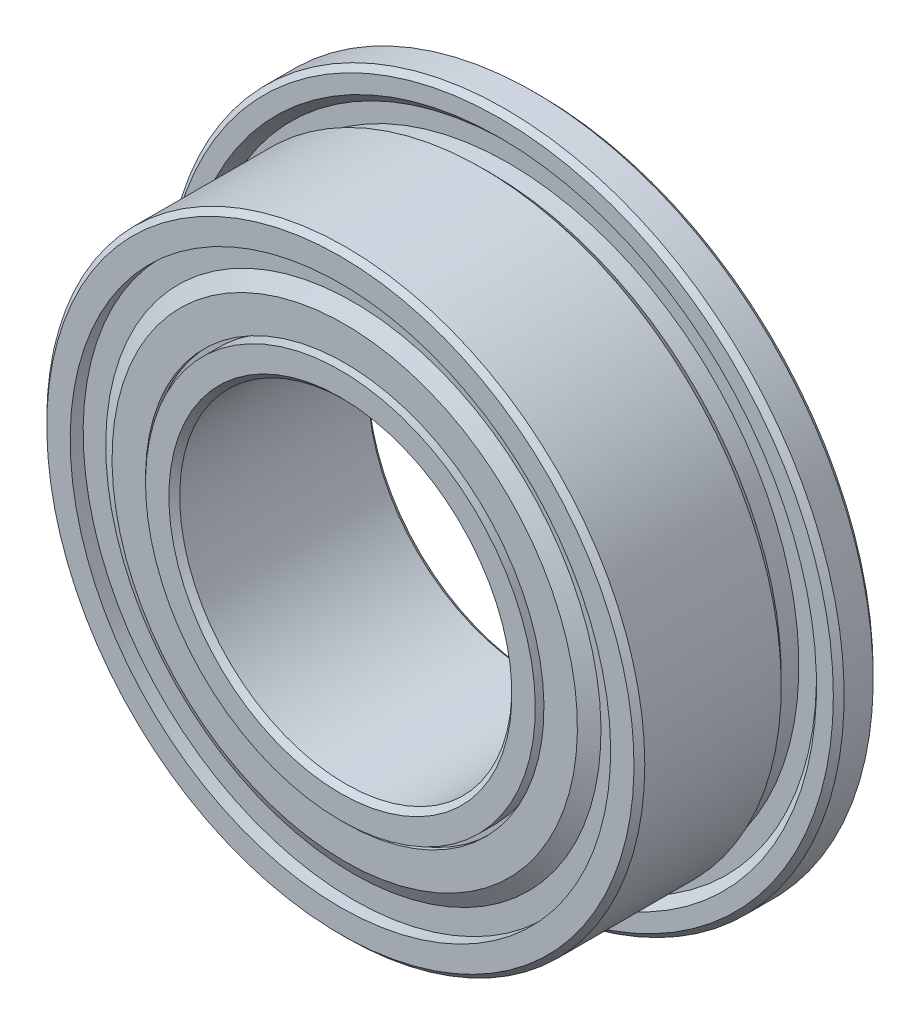
ISO-10303-21;
HEADER;
FILE_DESCRIPTION(('STEP AP214'),'2;1');
FILE_NAME('part.step','',(''),(''),'','','');
FILE_SCHEMA(('AUTOMOTIVE_DESIGN { 1 0 10303 214 1 1 1 1 }'));
ENDSEC;
DATA;
#1=APPLICATION_CONTEXT('core data for automotive mechanical design processes');
#2=APPLICATION_PROTOCOL_DEFINITION('international standard','automotive_design',2000,#1);
#3=PRODUCT_CONTEXT('',#1,'mechanical');
#4=PRODUCT('Part','Part','',(#3));
#5=PRODUCT_RELATED_PRODUCT_CATEGORY('part','',(#4));
#6=PRODUCT_DEFINITION_FORMATION('','',#4);
#7=PRODUCT_DEFINITION_CONTEXT('part definition',#1,'design');
#8=PRODUCT_DEFINITION('design','',#6,#7);
#9=PRODUCT_DEFINITION_SHAPE('','',#8);
#10=(LENGTH_UNIT() NAMED_UNIT(*) SI_UNIT(.MILLI.,.METRE.));
#11=(NAMED_UNIT(*) PLANE_ANGLE_UNIT() SI_UNIT($,.RADIAN.));
#12=(NAMED_UNIT(*) SI_UNIT($,.STERADIAN.) SOLID_ANGLE_UNIT());
#13=UNCERTAINTY_MEASURE_WITH_UNIT(LENGTH_MEASURE(1.E-05),#10,'distance_accuracy_value','');
#14=(GEOMETRIC_REPRESENTATION_CONTEXT(3) GLOBAL_UNCERTAINTY_ASSIGNED_CONTEXT((#13)) GLOBAL_UNIT_ASSIGNED_CONTEXT((#10,
#11,#12)) REPRESENTATION_CONTEXT('',''));
#15=CARTESIAN_POINT('',(0.,0.,0.));
#16=DIRECTION('',(0.,0.,1.));
#17=DIRECTION('',(1.,0.,0.));
#18=AXIS2_PLACEMENT_3D('',#15,#16,#17);
#19=CARTESIAN_POINT('',(0.,0.,0.));
#20=DIRECTION('',(0.,0.,1.));
#21=DIRECTION('',(0.,-1.,0.));
#22=AXIS2_PLACEMENT_3D('',#19,#20,#21);
#23=CYLINDRICAL_SURFACE('',#22,4.06666666666667);
#24=CARTESIAN_POINT('',(0.,0.,-1.24));
#25=DIRECTION('',(0.,0.,1.));
#26=DIRECTION('',(0.,-1.,0.));
#27=AXIS2_PLACEMENT_3D('',#24,#25,#26);
#28=CIRCLE('',#27,4.06666666666667);
#29=CARTESIAN_POINT('',(0.,-4.06666666666667,-1.24));
#30=VERTEX_POINT('',#29);
#31=EDGE_CURVE('E73',#30,#30,#28,.T.);
#32=ORIENTED_EDGE('',*,*,#31,.F.);
#33=EDGE_LOOP('',(#32));
#34=FACE_BOUND('',#33,.T.);
#35=CARTESIAN_POINT('',(0.,0.,-1.305));
#36=DIRECTION('',(0.,0.,1.));
#37=DIRECTION('',(0.,-1.,0.));
#38=AXIS2_PLACEMENT_3D('',#35,#36,#37);
#39=CIRCLE('',#38,4.06666666666667);
#40=CARTESIAN_POINT('',(0.,-4.06666666666667,-1.305));
#41=VERTEX_POINT('',#40);
#42=EDGE_CURVE('E12',#41,#41,#39,.T.);
#43=ORIENTED_EDGE('',*,*,#42,.T.);
#44=EDGE_LOOP('',(#43));
#45=FACE_BOUND('',#44,.T.);
#46=ADVANCED_FACE('F45',(#34,#45),#23,.T.);
#47=CARTESIAN_POINT('',(0.,4.06666666666667,-1.305));
#48=DIRECTION('',(0.,0.,1.));
#49=DIRECTION('',(0.,-1.,0.));
#50=AXIS2_PLACEMENT_3D('',#47,#48,#49);
#51=PLANE('',#50);
#52=ORIENTED_EDGE('',*,*,#42,.F.);
#53=EDGE_LOOP('',(#52));
#54=FACE_BOUND('',#53,.T.);
#55=CARTESIAN_POINT('',(0.,0.,-1.305));
#56=DIRECTION('',(0.,0.,1.));
#57=DIRECTION('',(0.,-1.,0.));
#58=AXIS2_PLACEMENT_3D('',#55,#56,#57);
#59=CIRCLE('',#58,3.72694050703183);
#60=CARTESIAN_POINT('',(0.,-3.72694050703183,-1.305));
#61=VERTEX_POINT('',#60);
#62=EDGE_CURVE('E51',#61,#61,#59,.T.);
#63=ORIENTED_EDGE('',*,*,#62,.T.);
#64=EDGE_LOOP('',(#63));
#65=FACE_BOUND('',#64,.T.);
#66=ADVANCED_FACE('F80',(#54,#65),#51,.F.);
#67=CARTESIAN_POINT('',(0.,0.,-1.435));
#68=DIRECTION('',(0.,0.,1.));
#69=DIRECTION('',(0.,-1.,0.));
#70=AXIS2_PLACEMENT_3D('',#67,#68,#69);
#71=CONICAL_SURFACE('',#70,3.50177390204788,1.0471975511966);
#72=ORIENTED_EDGE('',*,*,#62,.F.);
#73=EDGE_LOOP('',(#72));
#74=FACE_BOUND('',#73,.T.);
#75=CARTESIAN_POINT('',(0.,0.,-1.435));
#76=DIRECTION('',(0.,0.,1.));
#77=DIRECTION('',(0.,-1.,0.));
#78=AXIS2_PLACEMENT_3D('',#75,#76,#77);
#79=CIRCLE('',#78,3.50177390204788);
#80=CARTESIAN_POINT('',(0.,-3.50177390204788,-1.435));
#81=VERTEX_POINT('',#80);
#82=EDGE_CURVE('E55',#81,#81,#79,.T.);
#83=ORIENTED_EDGE('',*,*,#82,.T.);
#84=EDGE_LOOP('',(#83));
#85=FACE_BOUND('',#84,.T.);
#86=ADVANCED_FACE('F84',(#74,#85),#71,.T.);
#87=CARTESIAN_POINT('',(0.,3.50177390204788,-1.435));
#88=DIRECTION('',(0.,0.,1.));
#89=DIRECTION('',(0.,-1.,0.));
#90=AXIS2_PLACEMENT_3D('',#87,#88,#89);
#91=PLANE('',#90);
#92=ORIENTED_EDGE('',*,*,#82,.F.);
#93=EDGE_LOOP('',(#92));
#94=FACE_BOUND('',#93,.T.);
#95=CARTESIAN_POINT('',(0.,0.,-1.435));
#96=DIRECTION('',(0.,0.,1.));
#97=DIRECTION('',(0.,-1.,0.));
#98=AXIS2_PLACEMENT_3D('',#95,#96,#97);
#99=CIRCLE('',#98,2.99833333333333);
#100=CARTESIAN_POINT('',(0.,-2.99833333333333,-1.435));
#101=VERTEX_POINT('',#100);
#102=EDGE_CURVE('E59',#101,#101,#99,.T.);
#103=ORIENTED_EDGE('',*,*,#102,.T.);
#104=EDGE_LOOP('',(#103));
#105=FACE_BOUND('',#104,.T.);
#106=ADVANCED_FACE('F89',(#94,#105),#91,.F.);
#107=CARTESIAN_POINT('',(0.,0.,0.));
#108=DIRECTION('',(0.,0.,1.));
#109=DIRECTION('',(0.,-1.,0.));
#110=AXIS2_PLACEMENT_3D('',#107,#108,#109);
#111=CYLINDRICAL_SURFACE('',#110,2.99833333333333);
#112=ORIENTED_EDGE('',*,*,#102,.F.);
#113=EDGE_LOOP('',(#112));
#114=FACE_BOUND('',#113,.T.);
#115=CARTESIAN_POINT('',(0.,0.,-1.37));
#116=DIRECTION('',(0.,0.,1.));
#117=DIRECTION('',(0.,-1.,0.));
#118=AXIS2_PLACEMENT_3D('',#115,#116,#117);
#119=CIRCLE('',#118,2.99833333333333);
#120=CARTESIAN_POINT('',(0.,-2.99833333333333,-1.37));
#121=VERTEX_POINT('',#120);
#122=EDGE_CURVE('E64',#121,#121,#119,.T.);
#123=ORIENTED_EDGE('',*,*,#122,.T.);
#124=EDGE_LOOP('',(#123));
#125=FACE_BOUND('',#124,.T.);
#126=ADVANCED_FACE('F95',(#114,#125),#111,.F.);
#127=CARTESIAN_POINT('',(0.,3.48435720453986,-1.37));
#128=DIRECTION('',(0.,0.,-1.));
#129=DIRECTION('',(0.,1.,0.));
#130=AXIS2_PLACEMENT_3D('',#127,#128,#129);
#131=PLANE('',#130);
#132=ORIENTED_EDGE('',*,*,#122,.F.);
#133=EDGE_LOOP('',(#132));
#134=FACE_BOUND('',#133,.T.);
#135=CARTESIAN_POINT('',(0.,0.,-1.37));
#136=DIRECTION('',(0.,0.,1.));
#137=DIRECTION('',(0.,-1.,0.));
#138=AXIS2_PLACEMENT_3D('',#135,#136,#137);
#139=CIRCLE('',#138,3.48435720453986);
#140=CARTESIAN_POINT('',(0.,-3.48435720453986,-1.37));
#141=VERTEX_POINT('',#140);
#142=EDGE_CURVE('E67',#141,#141,#139,.T.);
#143=ORIENTED_EDGE('',*,*,#142,.T.);
#144=EDGE_LOOP('',(#143));
#145=FACE_BOUND('',#144,.T.);
#146=ADVANCED_FACE('F99',(#134,#145),#131,.F.);
#147=CARTESIAN_POINT('',(0.,0.,-1.24));
#148=DIRECTION('',(0.,0.,1.));
#149=DIRECTION('',(0.,-1.,0.));
#150=AXIS2_PLACEMENT_3D('',#147,#148,#149);
#151=CONICAL_SURFACE('',#150,3.70952380952381,1.0471975511966);
#152=ORIENTED_EDGE('',*,*,#142,.F.);
#153=EDGE_LOOP('',(#152));
#154=FACE_BOUND('',#153,.T.);
#155=CARTESIAN_POINT('',(0.,0.,-1.24));
#156=DIRECTION('',(0.,0.,1.));
#157=DIRECTION('',(0.,-1.,0.));
#158=AXIS2_PLACEMENT_3D('',#155,#156,#157);
#159=CIRCLE('',#158,3.70952380952381);
#160=CARTESIAN_POINT('',(0.,-3.70952380952381,-1.24));
#161=VERTEX_POINT('',#160);
#162=EDGE_CURVE('E70',#161,#161,#159,.T.);
#163=ORIENTED_EDGE('',*,*,#162,.T.);
#164=EDGE_LOOP('',(#163));
#165=FACE_BOUND('',#164,.T.);
#166=ADVANCED_FACE('F103',(#154,#165),#151,.F.);
#167=CARTESIAN_POINT('',(0.,4.06666666666667,-1.24));
#168=DIRECTION('',(0.,0.,-1.));
#169=DIRECTION('',(0.,1.,0.));
#170=AXIS2_PLACEMENT_3D('',#167,#168,#169);
#171=PLANE('',#170);
#172=ORIENTED_EDGE('',*,*,#162,.F.);
#173=EDGE_LOOP('',(#172));
#174=FACE_BOUND('',#173,.T.);
#175=ORIENTED_EDGE('',*,*,#31,.T.);
#176=EDGE_LOOP('',(#175));
#177=FACE_BOUND('',#176,.T.);
#178=ADVANCED_FACE('F77',(#174,#177),#171,.F.);
#179=CLOSED_SHELL('',(#46,#66,#86,#106,#126,#146,#166,#178));
#180=MANIFOLD_SOLID_BREP('B2',#179);
#181=CARTESIAN_POINT('',(0.,0.,0.));
#182=DIRECTION('',(0.,0.,1.));
#183=DIRECTION('',(0.,-1.,0.));
#184=AXIS2_PLACEMENT_3D('',#181,#182,#183);
#185=CYLINDRICAL_SURFACE('',#184,4.06666666666667);
#186=CARTESIAN_POINT('',(0.,0.,1.305));
#187=DIRECTION('',(0.,0.,1.));
#188=DIRECTION('',(0.,-1.,0.));
#189=AXIS2_PLACEMENT_3D('',#186,#187,#188);
#190=CIRCLE('',#189,4.06666666666667);
#191=CARTESIAN_POINT('',(0.,-4.06666666666667,1.305));
#192=VERTEX_POINT('',#191);
#193=EDGE_CURVE('E44',#192,#192,#190,.T.);
#194=ORIENTED_EDGE('',*,*,#193,.F.);
#195=EDGE_LOOP('',(#194));
#196=FACE_BOUND('',#195,.T.);
#197=CARTESIAN_POINT('',(0.,0.,1.24));
#198=DIRECTION('',(0.,0.,1.));
#199=DIRECTION('',(0.,-1.,0.));
#200=AXIS2_PLACEMENT_3D('',#197,#198,#199);
#201=CIRCLE('',#200,4.06666666666667);
#202=CARTESIAN_POINT('',(0.,-4.06666666666667,1.24));
#203=VERTEX_POINT('',#202);
#204=EDGE_CURVE('E200',#203,#203,#201,.T.);
#205=ORIENTED_EDGE('',*,*,#204,.T.);
#206=EDGE_LOOP('',(#205));
#207=FACE_BOUND('',#206,.T.);
#208=ADVANCED_FACE('F172',(#196,#207),#185,.T.);
#209=CARTESIAN_POINT('',(0.,4.06666666666667,1.305));
#210=DIRECTION('',(0.,0.,-1.));
#211=DIRECTION('',(0.,1.,0.));
#212=AXIS2_PLACEMENT_3D('',#209,#210,#211);
#213=PLANE('',#212);
#214=CARTESIAN_POINT('',(0.,0.,1.305));
#215=DIRECTION('',(0.,0.,1.));
#216=DIRECTION('',(0.,-1.,0.));
#217=AXIS2_PLACEMENT_3D('',#214,#215,#216);
#218=CIRCLE('',#217,3.72694050703183);
#219=CARTESIAN_POINT('',(0.,-3.72694050703183,1.305));
#220=VERTEX_POINT('',#219);
#221=EDGE_CURVE('E178',#220,#220,#218,.T.);
#222=ORIENTED_EDGE('',*,*,#221,.F.);
#223=EDGE_LOOP('',(#222));
#224=FACE_BOUND('',#223,.T.);
#225=ORIENTED_EDGE('',*,*,#193,.T.);
#226=EDGE_LOOP('',(#225));
#227=FACE_BOUND('',#226,.T.);
#228=ADVANCED_FACE('F237',(#224,#227),#213,.F.);
#229=CARTESIAN_POINT('',(0.,0.,1.305));
#230=DIRECTION('',(0.,0.,-1.));
#231=DIRECTION('',(0.,1.,0.));
#232=AXIS2_PLACEMENT_3D('',#229,#230,#231);
#233=CONICAL_SURFACE('',#232,3.72694050703183,1.0471975511966);
#234=CARTESIAN_POINT('',(0.,0.,1.435));
#235=DIRECTION('',(0.,0.,1.));
#236=DIRECTION('',(0.,-1.,0.));
#237=AXIS2_PLACEMENT_3D('',#234,#235,#236);
#238=CIRCLE('',#237,3.50177390204788);
#239=CARTESIAN_POINT('',(0.,-3.50177390204788,1.435));
#240=VERTEX_POINT('',#239);
#241=EDGE_CURVE('E182',#240,#240,#238,.T.);
#242=ORIENTED_EDGE('',*,*,#241,.F.);
#243=EDGE_LOOP('',(#242));
#244=FACE_BOUND('',#243,.T.);
#245=ORIENTED_EDGE('',*,*,#221,.T.);
#246=EDGE_LOOP('',(#245));
#247=FACE_BOUND('',#246,.T.);
#248=ADVANCED_FACE('F232',(#244,#247),#233,.T.);
#249=CARTESIAN_POINT('',(0.,3.50177390204788,1.435));
#250=DIRECTION('',(0.,0.,-1.));
#251=DIRECTION('',(0.,1.,0.));
#252=AXIS2_PLACEMENT_3D('',#249,#250,#251);
#253=PLANE('',#252);
#254=CARTESIAN_POINT('',(0.,0.,1.435));
#255=DIRECTION('',(0.,0.,1.));
#256=DIRECTION('',(0.,-1.,0.));
#257=AXIS2_PLACEMENT_3D('',#254,#255,#256);
#258=CIRCLE('',#257,2.99833333333333);
#259=CARTESIAN_POINT('',(0.,-2.99833333333333,1.435));
#260=VERTEX_POINT('',#259);
#261=EDGE_CURVE('E186',#260,#260,#258,.T.);
#262=ORIENTED_EDGE('',*,*,#261,.F.);
#263=EDGE_LOOP('',(#262));
#264=FACE_BOUND('',#263,.T.);
#265=ORIENTED_EDGE('',*,*,#241,.T.);
#266=EDGE_LOOP('',(#265));
#267=FACE_BOUND('',#266,.T.);
#268=ADVANCED_FACE('F226',(#264,#267),#253,.F.);
#269=CARTESIAN_POINT('',(0.,0.,0.));
#270=DIRECTION('',(0.,0.,1.));
#271=DIRECTION('',(0.,-1.,0.));
#272=AXIS2_PLACEMENT_3D('',#269,#270,#271);
#273=CYLINDRICAL_SURFACE('',#272,2.99833333333333);
#274=CARTESIAN_POINT('',(0.,0.,1.37));
#275=DIRECTION('',(0.,0.,1.));
#276=DIRECTION('',(0.,-1.,0.));
#277=AXIS2_PLACEMENT_3D('',#274,#275,#276);
#278=CIRCLE('',#277,2.99833333333333);
#279=CARTESIAN_POINT('',(0.,-2.99833333333333,1.37));
#280=VERTEX_POINT('',#279);
#281=EDGE_CURVE('E191',#280,#280,#278,.T.);
#282=ORIENTED_EDGE('',*,*,#281,.F.);
#283=EDGE_LOOP('',(#282));
#284=FACE_BOUND('',#283,.T.);
#285=ORIENTED_EDGE('',*,*,#261,.T.);
#286=EDGE_LOOP('',(#285));
#287=FACE_BOUND('',#286,.T.);
#288=ADVANCED_FACE('F220',(#284,#287),#273,.F.);
#289=CARTESIAN_POINT('',(0.,3.48435720453985,1.37));
#290=DIRECTION('',(0.,0.,1.));
#291=DIRECTION('',(0.,-1.,0.));
#292=AXIS2_PLACEMENT_3D('',#289,#290,#291);
#293=PLANE('',#292);
#294=CARTESIAN_POINT('',(0.,0.,1.37));
#295=DIRECTION('',(0.,0.,1.));
#296=DIRECTION('',(0.,-1.,0.));
#297=AXIS2_PLACEMENT_3D('',#294,#295,#296);
#298=CIRCLE('',#297,3.48435720453985);
#299=CARTESIAN_POINT('',(0.,-3.48435720453985,1.37));
#300=VERTEX_POINT('',#299);
#301=EDGE_CURVE('E194',#300,#300,#298,.T.);
#302=ORIENTED_EDGE('',*,*,#301,.F.);
#303=EDGE_LOOP('',(#302));
#304=FACE_BOUND('',#303,.T.);
#305=ORIENTED_EDGE('',*,*,#281,.T.);
#306=EDGE_LOOP('',(#305));
#307=FACE_BOUND('',#306,.T.);
#308=ADVANCED_FACE('F214',(#304,#307),#293,.F.);
#309=CARTESIAN_POINT('',(0.,0.,1.37));
#310=DIRECTION('',(0.,0.,-1.));
#311=DIRECTION('',(0.,1.,0.));
#312=AXIS2_PLACEMENT_3D('',#309,#310,#311);
#313=CONICAL_SURFACE('',#312,3.48435720453985,1.0471975511966);
#314=CARTESIAN_POINT('',(0.,0.,1.24));
#315=DIRECTION('',(0.,0.,1.));
#316=DIRECTION('',(0.,-1.,0.));
#317=AXIS2_PLACEMENT_3D('',#314,#315,#316);
#318=CIRCLE('',#317,3.70952380952381);
#319=CARTESIAN_POINT('',(0.,-3.70952380952381,1.24));
#320=VERTEX_POINT('',#319);
#321=EDGE_CURVE('E197',#320,#320,#318,.T.);
#322=ORIENTED_EDGE('',*,*,#321,.F.);
#323=EDGE_LOOP('',(#322));
#324=FACE_BOUND('',#323,.T.);
#325=ORIENTED_EDGE('',*,*,#301,.T.);
#326=EDGE_LOOP('',(#325));
#327=FACE_BOUND('',#326,.T.);
#328=ADVANCED_FACE('F208',(#324,#327),#313,.F.);
#329=CARTESIAN_POINT('',(0.,4.06666666666667,1.24));
#330=DIRECTION('',(0.,0.,1.));
#331=DIRECTION('',(0.,-1.,0.));
#332=AXIS2_PLACEMENT_3D('',#329,#330,#331);
#333=PLANE('',#332);
#334=ORIENTED_EDGE('',*,*,#204,.F.);
#335=EDGE_LOOP('',(#334));
#336=FACE_BOUND('',#335,.T.);
#337=ORIENTED_EDGE('',*,*,#321,.T.);
#338=EDGE_LOOP('',(#337));
#339=FACE_BOUND('',#338,.T.);
#340=ADVANCED_FACE('F205',(#336,#339),#333,.F.);
#341=CLOSED_SHELL('',(#208,#228,#248,#268,#288,#308,#328,#340));
#342=MANIFOLD_SOLID_BREP('B7',#341);
#343=CARTESIAN_POINT('',(-1.51859308691141,3.15339103765849,0.));
#344=DIRECTION('',(-0.433883739117546,0.900968867902425,0.));
#345=DIRECTION('',(0.900968867902425,0.433883739117546,0.));
#346=AXIS2_PLACEMENT_3D('',#343,#344,#345);
#347=SPHERICAL_SURFACE('',#346,0.6);
#348=CARTESIAN_POINT('',(-1.77892333038194,3.69397235839994,0.));
#349=VERTEX_POINT('',#348);
#350=VERTEX_LOOP('',#349);
#351=FACE_BOUND('',#350,.T.);
#352=ADVANCED_FACE('F299',(#351),#347,.T.);
#353=CLOSED_SHELL('',(#352));
#354=MANIFOLD_SOLID_BREP('B39',#353);
#355=CARTESIAN_POINT('',(-2.73641018863808,2.1822143065056,0.));
#356=DIRECTION('',(-0.781831482468022,0.623489801858743,0.));
#357=DIRECTION('',(0.623489801858743,0.781831482468022,0.));
#358=AXIS2_PLACEMENT_3D('',#355,#356,#357);
#359=SPHERICAL_SURFACE('',#358,0.6);
#360=CARTESIAN_POINT('',(-3.20550907811889,2.55630818762085,0.));
#361=VERTEX_POINT('',#360);
#362=VERTEX_LOOP('',#361);
#363=FACE_BOUND('',#362,.T.);
#364=ADVANCED_FACE('F317',(#363),#359,.T.);
#365=CLOSED_SHELL('',(#364));
#366=MANIFOLD_SOLID_BREP('B168',#365);
#367=CARTESIAN_POINT('',(-3.41224769263637,0.778823268847136,0.));
#368=DIRECTION('',(-0.974927912181821,0.222520933956325,0.));
#369=DIRECTION('',(0.222520933956325,0.974927912181821,0.));
#370=AXIS2_PLACEMENT_3D('',#367,#368,#369);
#371=SPHERICAL_SURFACE('',#370,0.6);
#372=CARTESIAN_POINT('',(-3.99720443994547,0.912335829220931,0.));
#373=VERTEX_POINT('',#372);
#374=VERTEX_LOOP('',#373);
#375=FACE_BOUND('',#374,.T.);
#376=ADVANCED_FACE('F335',(#375),#371,.T.);
#377=CLOSED_SHELL('',(#376));
#378=MANIFOLD_SOLID_BREP('B295',#377);
#379=CARTESIAN_POINT('',(-3.41224769263639,-0.778823268847068,0.));
#380=DIRECTION('',(-0.974927912181826,-0.222520933956305,0.));
#381=DIRECTION('',(-0.222520933956305,0.974927912181826,0.));
#382=AXIS2_PLACEMENT_3D('',#379,#380,#381);
#383=SPHERICAL_SURFACE('',#382,0.6);
#384=CARTESIAN_POINT('',(-3.99720443994549,-0.912335829220851,0.));
#385=VERTEX_POINT('',#384);
#386=VERTEX_LOOP('',#385);
#387=FACE_BOUND('',#386,.T.);
#388=ADVANCED_FACE('F353',(#387),#383,.T.);
#389=CLOSED_SHELL('',(#388));
#390=MANIFOLD_SOLID_BREP('B313',#389);
#391=CARTESIAN_POINT('',(-2.73641018863812,-2.18221430650554,0.));
#392=DIRECTION('',(-0.781831482468035,-0.623489801858727,0.));
#393=DIRECTION('',(-0.623489801858727,0.781831482468035,0.));
#394=AXIS2_PLACEMENT_3D('',#391,#392,#393);
#395=SPHERICAL_SURFACE('',#394,0.6);
#396=CARTESIAN_POINT('',(-3.20550907811894,-2.55630818762078,0.));
#397=VERTEX_POINT('',#396);
#398=VERTEX_LOOP('',#397);
#399=FACE_BOUND('',#398,.T.);
#400=ADVANCED_FACE('F371',(#399),#395,.T.);
#401=CLOSED_SHELL('',(#400));
#402=MANIFOLD_SOLID_BREP('B331',#401);
#403=CARTESIAN_POINT('',(-1.51859308691148,-3.15339103765845,0.));
#404=DIRECTION('',(-0.433883739117565,-0.900968867902416,0.));
#405=DIRECTION('',(-0.900968867902416,0.433883739117565,0.));
#406=AXIS2_PLACEMENT_3D('',#403,#404,#405);
#407=SPHERICAL_SURFACE('',#406,0.6);
#408=CARTESIAN_POINT('',(-1.77892333038202,-3.6939723583999,0.));
#409=VERTEX_POINT('',#408);
#410=VERTEX_LOOP('',#409);
#411=FACE_BOUND('',#410,.T.);
#412=ADVANCED_FACE('F389',(#411),#407,.T.);
#413=CLOSED_SHELL('',(#412));
#414=MANIFOLD_SOLID_BREP('B349',#413);
#415=CARTESIAN_POINT('',(0.,-3.5,0.));
#416=DIRECTION('',(0.,-1.,0.));
#417=DIRECTION('',(-1.,0.,0.));
#418=AXIS2_PLACEMENT_3D('',#415,#416,#417);
#419=SPHERICAL_SURFACE('',#418,0.6);
#420=CARTESIAN_POINT('',(0.,-4.1,0.));
#421=VERTEX_POINT('',#420);
#422=VERTEX_LOOP('',#421);
#423=FACE_BOUND('',#422,.T.);
#424=ADVANCED_FACE('F407',(#423),#419,.T.);
#425=CLOSED_SHELL('',(#424));
#426=MANIFOLD_SOLID_BREP('B367',#425);
#427=CARTESIAN_POINT('',(1.51859308691143,-3.15339103765848,0.));
#428=DIRECTION('',(0.433883739117553,-0.900968867902422,0.));
#429=DIRECTION('',(-0.900968867902422,-0.433883739117553,0.));
#430=AXIS2_PLACEMENT_3D('',#427,#428,#429);
#431=SPHERICAL_SURFACE('',#430,0.6);
#432=CARTESIAN_POINT('',(1.77892333038197,-3.69397235839993,0.));
#433=VERTEX_POINT('',#432);
#434=VERTEX_LOOP('',#433);
#435=FACE_BOUND('',#434,.T.);
#436=ADVANCED_FACE('F425',(#435),#431,.T.);
#437=CLOSED_SHELL('',(#436));
#438=MANIFOLD_SOLID_BREP('B385',#437);
#439=CARTESIAN_POINT('',(2.73641018863809,-2.18221430650558,0.));
#440=DIRECTION('',(0.781831482468027,-0.623489801858737,0.));
#441=DIRECTION('',(-0.623489801858737,-0.781831482468027,0.));
#442=AXIS2_PLACEMENT_3D('',#439,#440,#441);
#443=SPHERICAL_SURFACE('',#442,0.6);
#444=CARTESIAN_POINT('',(3.20550907811891,-2.55630818762082,0.));
#445=VERTEX_POINT('',#444);
#446=VERTEX_LOOP('',#445);
#447=FACE_BOUND('',#446,.T.);
#448=ADVANCED_FACE('F443',(#447),#443,.T.);
#449=CLOSED_SHELL('',(#448));
#450=MANIFOLD_SOLID_BREP('B403',#449);
#451=CARTESIAN_POINT('',(3.41224769263638,-0.778823268847114,0.));
#452=DIRECTION('',(0.974927912181823,-0.222520933956318,0.));
#453=DIRECTION('',(-0.222520933956318,-0.974927912181823,0.));
#454=AXIS2_PLACEMENT_3D('',#451,#452,#453);
#455=SPHERICAL_SURFACE('',#454,0.6);
#456=CARTESIAN_POINT('',(3.99720443994547,-0.912335829220905,0.));
#457=VERTEX_POINT('',#456);
#458=VERTEX_LOOP('',#457);
#459=FACE_BOUND('',#458,.T.);
#460=ADVANCED_FACE('F461',(#459),#455,.T.);
#461=CLOSED_SHELL('',(#460));
#462=MANIFOLD_SOLID_BREP('B421',#461);
#463=CARTESIAN_POINT('',(3.41224769263638,0.77882326884709,0.));
#464=DIRECTION('',(0.974927912181824,0.222520933956311,0.));
#465=DIRECTION('',(0.222520933956311,-0.974927912181824,0.));
#466=AXIS2_PLACEMENT_3D('',#463,#464,#465);
#467=SPHERICAL_SURFACE('',#466,0.6);
#468=CARTESIAN_POINT('',(3.99720443994548,0.912335829220877,0.));
#469=VERTEX_POINT('',#468);
#470=VERTEX_LOOP('',#469);
#471=FACE_BOUND('',#470,.T.);
#472=ADVANCED_FACE('F479',(#471),#467,.T.);
#473=CLOSED_SHELL('',(#472));
#474=MANIFOLD_SOLID_BREP('B439',#473);
#475=CARTESIAN_POINT('',(2.73641018863811,2.18221430650556,0.));
#476=DIRECTION('',(0.781831482468031,0.623489801858732,0.));
#477=DIRECTION('',(0.623489801858732,-0.781831482468031,0.));
#478=AXIS2_PLACEMENT_3D('',#475,#476,#477);
#479=SPHERICAL_SURFACE('',#478,0.6);
#480=CARTESIAN_POINT('',(3.20550907811893,2.5563081876208,0.));
#481=VERTEX_POINT('',#480);
#482=VERTEX_LOOP('',#481);
#483=FACE_BOUND('',#482,.T.);
#484=ADVANCED_FACE('F497',(#483),#479,.T.);
#485=CLOSED_SHELL('',(#484));
#486=MANIFOLD_SOLID_BREP('B457',#485);
#487=CARTESIAN_POINT('',(1.51859308691146,3.15339103765846,0.));
#488=DIRECTION('',(0.433883739117559,0.900968867902419,0.));
#489=DIRECTION('',(0.900968867902419,-0.433883739117559,0.));
#490=AXIS2_PLACEMENT_3D('',#487,#488,#489);
#491=SPHERICAL_SURFACE('',#490,0.6);
#492=CARTESIAN_POINT('',(1.77892333038199,3.69397235839992,0.));
#493=VERTEX_POINT('',#492);
#494=VERTEX_LOOP('',#493);
#495=FACE_BOUND('',#494,.T.);
#496=ADVANCED_FACE('F515',(#495),#491,.T.);
#497=CLOSED_SHELL('',(#496));
#498=MANIFOLD_SOLID_BREP('B475',#497);
#499=CARTESIAN_POINT('',(0.,3.5,0.));
#500=DIRECTION('',(0.,1.,0.));
#501=DIRECTION('',(1.,0.,0.));
#502=AXIS2_PLACEMENT_3D('',#499,#500,#501);
#503=SPHERICAL_SURFACE('',#502,0.6);
#504=CARTESIAN_POINT('',(0.,4.1,0.));
#505=VERTEX_POINT('',#504);
#506=VERTEX_LOOP('',#505);
#507=FACE_BOUND('',#506,.T.);
#508=ADVANCED_FACE('F536',(#507),#503,.T.);
#509=CLOSED_SHELL('',(#508));
#510=MANIFOLD_SOLID_BREP('B493',#509);
#511=CARTESIAN_POINT('',(0.,0.,0.));
#512=DIRECTION('',(0.,0.,1.));
#513=DIRECTION('',(0.,-1.,0.));
#514=AXIS2_PLACEMENT_3D('',#511,#512,#513);
#515=CYLINDRICAL_SURFACE('',#514,3.15);
#516=CARTESIAN_POINT('',(0.,0.,0.487339717240448));
#517=DIRECTION('',(0.,0.,1.));
#518=DIRECTION('',(0.,-1.,0.));
#519=AXIS2_PLACEMENT_3D('',#516,#517,#518);
#520=CIRCLE('',#519,3.15);
#521=CARTESIAN_POINT('',(0.,-3.15,0.487339717240448));
#522=VERTEX_POINT('',#521);
#523=EDGE_CURVE('E580',#522,#522,#520,.T.);
#524=ORIENTED_EDGE('',*,*,#523,.T.);
#525=EDGE_LOOP('',(#524));
#526=FACE_BOUND('',#525,.T.);
#527=CARTESIAN_POINT('',(0.,0.,1.24));
#528=DIRECTION('',(0.,0.,1.));
#529=DIRECTION('',(0.,-1.,0.));
#530=AXIS2_PLACEMENT_3D('',#527,#528,#529);
#531=CIRCLE('',#530,3.15);
#532=CARTESIAN_POINT('',(0.,-3.15,1.24));
#533=VERTEX_POINT('',#532);
#534=EDGE_CURVE('E598',#533,#533,#531,.T.);
#535=ORIENTED_EDGE('',*,*,#534,.F.);
#536=EDGE_LOOP('',(#535));
#537=FACE_BOUND('',#536,.T.);
#538=ADVANCED_FACE('F557',(#526,#537),#515,.T.);
#539=CARTESIAN_POINT('',(0.,2.5,1.5));
#540=DIRECTION('',(0.,0.,-1.));
#541=DIRECTION('',(0.,1.,0.));
#542=AXIS2_PLACEMENT_3D('',#539,#540,#541);
#543=PLANE('',#542);
#544=CARTESIAN_POINT('',(0.,0.,1.5));
#545=DIRECTION('',(0.,0.,-1.));
#546=DIRECTION('',(0.,1.,0.));
#547=AXIS2_PLACEMENT_3D('',#544,#545,#546);
#548=CIRCLE('',#547,2.58125);
#549=CARTESIAN_POINT('',(0.,2.58125,1.5));
#550=VERTEX_POINT('',#549);
#551=EDGE_CURVE('E535',#550,#550,#548,.T.);
#552=ORIENTED_EDGE('',*,*,#551,.T.);
#553=EDGE_LOOP('',(#552));
#554=FACE_BOUND('',#553,.T.);
#555=CARTESIAN_POINT('',(0.,0.,1.5));
#556=DIRECTION('',(0.,0.,1.));
#557=DIRECTION('',(0.,-1.,0.));
#558=AXIS2_PLACEMENT_3D('',#555,#556,#557);
#559=CIRCLE('',#558,2.93333333333333);
#560=CARTESIAN_POINT('',(0.,-2.93333333333333,1.5));
#561=VERTEX_POINT('',#560);
#562=EDGE_CURVE('E592',#561,#561,#559,.T.);
#563=ORIENTED_EDGE('',*,*,#562,.T.);
#564=EDGE_LOOP('',(#563));
#565=FACE_BOUND('',#564,.T.);
#566=ADVANCED_FACE('F606',(#554,#565),#543,.F.);
#567=CARTESIAN_POINT('',(0.,0.,0.));
#568=DIRECTION('',(0.,0.,1.));
#569=DIRECTION('',(0.,-1.,0.));
#570=AXIS2_PLACEMENT_3D('',#567,#568,#569);
#571=CYLINDRICAL_SURFACE('',#570,3.15);
#572=CARTESIAN_POINT('',(0.,0.,-0.487339717240448));
#573=DIRECTION('',(0.,0.,1.));
#574=DIRECTION('',(0.,-1.,0.));
#575=AXIS2_PLACEMENT_3D('',#572,#573,#574);
#576=CIRCLE('',#575,3.15);
#577=CARTESIAN_POINT('',(0.,-3.15,-0.487339717240448));
#578=VERTEX_POINT('',#577);
#579=EDGE_CURVE('E577',#578,#578,#576,.T.);
#580=ORIENTED_EDGE('',*,*,#579,.F.);
#581=EDGE_LOOP('',(#580));
#582=FACE_BOUND('',#581,.T.);
#583=CARTESIAN_POINT('',(0.,0.,-1.24));
#584=DIRECTION('',(0.,0.,1.));
#585=DIRECTION('',(0.,-1.,0.));
#586=AXIS2_PLACEMENT_3D('',#583,#584,#585);
#587=CIRCLE('',#586,3.15);
#588=CARTESIAN_POINT('',(0.,-3.15,-1.24));
#589=VERTEX_POINT('',#588);
#590=EDGE_CURVE('E589',#589,#589,#587,.T.);
#591=ORIENTED_EDGE('',*,*,#590,.T.);
#592=EDGE_LOOP('',(#591));
#593=FACE_BOUND('',#592,.T.);
#594=ADVANCED_FACE('F612',(#582,#593),#571,.T.);
#595=CARTESIAN_POINT('',(0.,3.15,-1.5));
#596=DIRECTION('',(0.,0.,1.));
#597=DIRECTION('',(0.,-1.,0.));
#598=AXIS2_PLACEMENT_3D('',#595,#596,#597);
#599=PLANE('',#598);
#600=CARTESIAN_POINT('',(0.,0.,-1.5));
#601=DIRECTION('',(0.,0.,1.));
#602=DIRECTION('',(0.,-1.,0.));
#603=AXIS2_PLACEMENT_3D('',#600,#601,#602);
#604=CIRCLE('',#603,2.58125);
#605=CARTESIAN_POINT('',(0.,-2.58125,-1.5));
#606=VERTEX_POINT('',#605);
#607=EDGE_CURVE('E572',#606,#606,#604,.T.);
#608=ORIENTED_EDGE('',*,*,#607,.T.);
#609=EDGE_LOOP('',(#608));
#610=FACE_BOUND('',#609,.T.);
#611=CARTESIAN_POINT('',(0.,0.,-1.5));
#612=DIRECTION('',(0.,0.,1.));
#613=DIRECTION('',(0.,-1.,0.));
#614=AXIS2_PLACEMENT_3D('',#611,#612,#613);
#615=CIRCLE('',#614,2.93333333333333);
#616=CARTESIAN_POINT('',(0.,-2.93333333333333,-1.5));
#617=VERTEX_POINT('',#616);
#618=EDGE_CURVE('E583',#617,#617,#615,.T.);
#619=ORIENTED_EDGE('',*,*,#618,.F.);
#620=EDGE_LOOP('',(#619));
#621=FACE_BOUND('',#620,.T.);
#622=ADVANCED_FACE('F620',(#610,#621),#599,.F.);
#623=CARTESIAN_POINT('',(0.,0.,0.));
#624=DIRECTION('',(0.,0.,1.));
#625=DIRECTION('',(0.,-1.,0.));
#626=AXIS2_PLACEMENT_3D('',#623,#624,#625);
#627=TOROIDAL_SURFACE('',#626,3.5,0.6);
#628=ORIENTED_EDGE('',*,*,#523,.F.);
#629=EDGE_LOOP('',(#628));
#630=FACE_BOUND('',#629,.T.);
#631=ORIENTED_EDGE('',*,*,#579,.T.);
#632=EDGE_LOOP('',(#631));
#633=FACE_BOUND('',#632,.T.);
#634=ADVANCED_FACE('F616',(#630,#633),#627,.F.);
#635=CARTESIAN_POINT('',(0.,0.,0.));
#636=DIRECTION('',(0.,0.,1.));
#637=DIRECTION('',(0.,-1.,0.));
#638=AXIS2_PLACEMENT_3D('',#635,#636,#637);
#639=CYLINDRICAL_SURFACE('',#638,2.5);
#640=CARTESIAN_POINT('',(0.,0.,-1.41875));
#641=DIRECTION('',(0.,0.,1.));
#642=DIRECTION('',(0.,-1.,0.));
#643=AXIS2_PLACEMENT_3D('',#640,#641,#642);
#644=CIRCLE('',#643,2.5);
#645=CARTESIAN_POINT('',(0.,-2.5,-1.41875));
#646=VERTEX_POINT('',#645);
#647=EDGE_CURVE('E564',#646,#646,#644,.F.);
#648=ORIENTED_EDGE('',*,*,#647,.T.);
#649=EDGE_LOOP('',(#648));
#650=FACE_BOUND('',#649,.T.);
#651=CARTESIAN_POINT('',(0.,0.,1.41875));
#652=DIRECTION('',(0.,0.,-1.));
#653=DIRECTION('',(0.,1.,0.));
#654=AXIS2_PLACEMENT_3D('',#651,#652,#653);
#655=CIRCLE('',#654,2.5);
#656=CARTESIAN_POINT('',(0.,2.5,1.41875));
#657=VERTEX_POINT('',#656);
#658=EDGE_CURVE('E568',#657,#657,#655,.F.);
#659=ORIENTED_EDGE('',*,*,#658,.T.);
#660=EDGE_LOOP('',(#659));
#661=FACE_BOUND('',#660,.T.);
#662=ADVANCED_FACE('F619',(#650,#661),#639,.F.);
#663=CARTESIAN_POINT('',(0.,0.,-1.5));
#664=DIRECTION('',(0.,0.,-1.));
#665=DIRECTION('',(0.,1.,0.));
#666=AXIS2_PLACEMENT_3D('',#663,#664,#665);
#667=CONICAL_SURFACE('',#666,2.58125,0.78539816339745);
#668=ORIENTED_EDGE('',*,*,#647,.F.);
#669=EDGE_LOOP('',(#668));
#670=FACE_BOUND('',#669,.T.);
#671=ORIENTED_EDGE('',*,*,#607,.F.);
#672=EDGE_LOOP('',(#671));
#673=FACE_BOUND('',#672,.T.);
#674=ADVANCED_FACE('F624',(#670,#673),#667,.F.);
#675=CARTESIAN_POINT('',(0.,0.,1.41875));
#676=DIRECTION('',(0.,0.,1.));
#677=DIRECTION('',(0.,-1.,0.));
#678=AXIS2_PLACEMENT_3D('',#675,#676,#677);
#679=CONICAL_SURFACE('',#678,2.5,0.78539816339745);
#680=ORIENTED_EDGE('',*,*,#551,.F.);
#681=EDGE_LOOP('',(#680));
#682=FACE_BOUND('',#681,.T.);
#683=ORIENTED_EDGE('',*,*,#658,.F.);
#684=EDGE_LOOP('',(#683));
#685=FACE_BOUND('',#684,.T.);
#686=ADVANCED_FACE('F559',(#682,#685),#679,.F.);
#687=CARTESIAN_POINT('',(0.,0.,0.));
#688=DIRECTION('',(0.,0.,1.));
#689=DIRECTION('',(0.,-1.,0.));
#690=AXIS2_PLACEMENT_3D('',#687,#688,#689);
#691=CYLINDRICAL_SURFACE('',#690,2.93333333333333);
#692=ORIENTED_EDGE('',*,*,#618,.T.);
#693=EDGE_LOOP('',(#692));
#694=FACE_BOUND('',#693,.T.);
#695=CARTESIAN_POINT('',(0.,0.,-1.24));
#696=DIRECTION('',(0.,0.,1.));
#697=DIRECTION('',(0.,-1.,0.));
#698=AXIS2_PLACEMENT_3D('',#695,#696,#697);
#699=CIRCLE('',#698,2.93333333333333);
#700=CARTESIAN_POINT('',(0.,-2.93333333333333,-1.24));
#701=VERTEX_POINT('',#700);
#702=EDGE_CURVE('E586',#701,#701,#699,.T.);
#703=ORIENTED_EDGE('',*,*,#702,.F.);
#704=EDGE_LOOP('',(#703));
#705=FACE_BOUND('',#704,.T.);
#706=ADVANCED_FACE('F631',(#694,#705),#691,.T.);
#707=CARTESIAN_POINT('',(0.,3.15,-1.24));
#708=DIRECTION('',(0.,0.,-1.));
#709=DIRECTION('',(0.,1.,0.));
#710=AXIS2_PLACEMENT_3D('',#707,#708,#709);
#711=PLANE('',#710);
#712=ORIENTED_EDGE('',*,*,#702,.T.);
#713=EDGE_LOOP('',(#712));
#714=FACE_BOUND('',#713,.T.);
#715=ORIENTED_EDGE('',*,*,#590,.F.);
#716=EDGE_LOOP('',(#715));
#717=FACE_BOUND('',#716,.T.);
#718=ADVANCED_FACE('F643',(#714,#717),#711,.T.);
#719=CARTESIAN_POINT('',(0.,0.,0.));
#720=DIRECTION('',(0.,0.,1.));
#721=DIRECTION('',(0.,-1.,0.));
#722=AXIS2_PLACEMENT_3D('',#719,#720,#721);
#723=CYLINDRICAL_SURFACE('',#722,2.93333333333333);
#724=CARTESIAN_POINT('',(0.,0.,1.24));
#725=DIRECTION('',(0.,0.,1.));
#726=DIRECTION('',(0.,-1.,0.));
#727=AXIS2_PLACEMENT_3D('',#724,#725,#726);
#728=CIRCLE('',#727,2.93333333333333);
#729=CARTESIAN_POINT('',(0.,-2.93333333333333,1.24));
#730=VERTEX_POINT('',#729);
#731=EDGE_CURVE('E595',#730,#730,#728,.T.);
#732=ORIENTED_EDGE('',*,*,#731,.T.);
#733=EDGE_LOOP('',(#732));
#734=FACE_BOUND('',#733,.T.);
#735=ORIENTED_EDGE('',*,*,#562,.F.);
#736=EDGE_LOOP('',(#735));
#737=FACE_BOUND('',#736,.T.);
#738=ADVANCED_FACE('F649',(#734,#737),#723,.T.);
#739=CARTESIAN_POINT('',(0.,3.15,1.24));
#740=DIRECTION('',(0.,0.,1.));
#741=DIRECTION('',(0.,-1.,0.));
#742=AXIS2_PLACEMENT_3D('',#739,#740,#741);
#743=PLANE('',#742);
#744=ORIENTED_EDGE('',*,*,#534,.T.);
#745=EDGE_LOOP('',(#744));
#746=FACE_BOUND('',#745,.T.);
#747=ORIENTED_EDGE('',*,*,#731,.F.);
#748=EDGE_LOOP('',(#747));
#749=FACE_BOUND('',#748,.T.);
#750=ADVANCED_FACE('F602',(#746,#749),#743,.T.);
#751=CLOSED_SHELL('',(#538,#566,#594,#622,#634,#662,#674,#686,#706,#718,#738,#750));
#752=MANIFOLD_SOLID_BREP('B511',#751);
#753=CARTESIAN_POINT('',(0.,3.85,-1.5));
#754=DIRECTION('',(0.,0.,1.));
#755=DIRECTION('',(0.,-1.,0.));
#756=AXIS2_PLACEMENT_3D('',#753,#754,#755);
#757=PLANE('',#756);
#758=CARTESIAN_POINT('',(0.,0.,-1.5));
#759=DIRECTION('',(0.,0.,1.));
#760=DIRECTION('',(0.,-1.,0.));
#761=AXIS2_PLACEMENT_3D('',#758,#759,#760);
#762=CIRCLE('',#761,5.01875);
#763=CARTESIAN_POINT('',(0.,-5.01875,-1.5));
#764=VERTEX_POINT('',#763);
#765=EDGE_CURVE('E754',#764,#764,#762,.F.);
#766=ORIENTED_EDGE('',*,*,#765,.T.);
#767=EDGE_LOOP('',(#766));
#768=FACE_BOUND('',#767,.T.);
#769=CARTESIAN_POINT('',(0.,0.,-1.5));
#770=DIRECTION('',(0.,0.,1.));
#771=DIRECTION('',(0.,-1.,0.));
#772=AXIS2_PLACEMENT_3D('',#769,#770,#771);
#773=CIRCLE('',#772,4.06666666666667);
#774=CARTESIAN_POINT('',(0.,-4.06666666666667,-1.5));
#775=VERTEX_POINT('',#774);
#776=EDGE_CURVE('E795',#775,#775,#773,.T.);
#777=ORIENTED_EDGE('',*,*,#776,.T.);
#778=EDGE_LOOP('',(#777));
#779=FACE_BOUND('',#778,.T.);
#780=ADVANCED_FACE('F739',(#768,#779),#757,.F.);
#781=CARTESIAN_POINT('',(0.,0.,0.));
#782=DIRECTION('',(0.,0.,1.));
#783=DIRECTION('',(0.,-1.,0.));
#784=AXIS2_PLACEMENT_3D('',#781,#782,#783);
#785=CYLINDRICAL_SURFACE('',#784,3.85);
#786=CARTESIAN_POINT('',(0.,0.,-0.487339717240448));
#787=DIRECTION('',(0.,0.,1.));
#788=DIRECTION('',(0.,-1.,0.));
#789=AXIS2_PLACEMENT_3D('',#786,#787,#788);
#790=CIRCLE('',#789,3.85);
#791=CARTESIAN_POINT('',(0.,-3.85,-0.487339717240448));
#792=VERTEX_POINT('',#791);
#793=EDGE_CURVE('E765',#792,#792,#790,.T.);
#794=ORIENTED_EDGE('',*,*,#793,.T.);
#795=EDGE_LOOP('',(#794));
#796=FACE_BOUND('',#795,.T.);
#797=CARTESIAN_POINT('',(0.,0.,-1.24));
#798=DIRECTION('',(0.,0.,1.));
#799=DIRECTION('',(0.,-1.,0.));
#800=AXIS2_PLACEMENT_3D('',#797,#798,#799);
#801=CIRCLE('',#800,3.85);
#802=CARTESIAN_POINT('',(0.,-3.85,-1.24));
#803=VERTEX_POINT('',#802);
#804=EDGE_CURVE('E801',#803,#803,#801,.T.);
#805=ORIENTED_EDGE('',*,*,#804,.F.);
#806=EDGE_LOOP('',(#805));
#807=FACE_BOUND('',#806,.T.);
#808=ADVANCED_FACE('F808',(#796,#807),#785,.F.);
#809=CARTESIAN_POINT('',(0.,0.,0.));
#810=DIRECTION('',(0.,0.,1.));
#811=DIRECTION('',(0.,-1.,0.));
#812=AXIS2_PLACEMENT_3D('',#809,#810,#811);
#813=CYLINDRICAL_SURFACE('',#812,3.85);
#814=CARTESIAN_POINT('',(0.,0.,0.487339717240448));
#815=DIRECTION('',(0.,0.,1.));
#816=DIRECTION('',(0.,-1.,0.));
#817=AXIS2_PLACEMENT_3D('',#814,#815,#816);
#818=CIRCLE('',#817,3.85);
#819=CARTESIAN_POINT('',(0.,-3.85,0.487339717240448));
#820=VERTEX_POINT('',#819);
#821=EDGE_CURVE('E768',#820,#820,#818,.T.);
#822=ORIENTED_EDGE('',*,*,#821,.F.);
#823=EDGE_LOOP('',(#822));
#824=FACE_BOUND('',#823,.T.);
#825=CARTESIAN_POINT('',(0.,0.,1.24));
#826=DIRECTION('',(0.,0.,1.));
#827=DIRECTION('',(0.,-1.,0.));
#828=AXIS2_PLACEMENT_3D('',#825,#826,#827);
#829=CIRCLE('',#828,3.85);
#830=CARTESIAN_POINT('',(0.,-3.85,1.24));
#831=VERTEX_POINT('',#830);
#832=EDGE_CURVE('E792',#831,#831,#829,.T.);
#833=ORIENTED_EDGE('',*,*,#832,.T.);
#834=EDGE_LOOP('',(#833));
#835=FACE_BOUND('',#834,.T.);
#836=ADVANCED_FACE('F810',(#824,#835),#813,.F.);
#837=CARTESIAN_POINT('',(0.,4.5,1.5));
#838=DIRECTION('',(0.,0.,-1.));
#839=DIRECTION('',(0.,1.,0.));
#840=AXIS2_PLACEMENT_3D('',#837,#838,#839);
#841=PLANE('',#840);
#842=CARTESIAN_POINT('',(0.,0.,1.5));
#843=DIRECTION('',(0.,0.,-1.));
#844=DIRECTION('',(0.,1.,0.));
#845=AXIS2_PLACEMENT_3D('',#842,#843,#844);
#846=CIRCLE('',#845,4.41875);
#847=CARTESIAN_POINT('',(0.,4.41875,1.5));
#848=VERTEX_POINT('',#847);
#849=EDGE_CURVE('E746',#848,#848,#846,.F.);
#850=ORIENTED_EDGE('',*,*,#849,.T.);
#851=EDGE_LOOP('',(#850));
#852=FACE_BOUND('',#851,.T.);
#853=CARTESIAN_POINT('',(0.,0.,1.5));
#854=DIRECTION('',(0.,0.,1.));
#855=DIRECTION('',(0.,-1.,0.));
#856=AXIS2_PLACEMENT_3D('',#853,#854,#855);
#857=CIRCLE('',#856,4.06666666666667);
#858=CARTESIAN_POINT('',(0.,-4.06666666666667,1.5));
#859=VERTEX_POINT('',#858);
#860=EDGE_CURVE('E786',#859,#859,#857,.T.);
#861=ORIENTED_EDGE('',*,*,#860,.F.);
#862=EDGE_LOOP('',(#861));
#863=FACE_BOUND('',#862,.T.);
#864=ADVANCED_FACE('F817',(#852,#863),#841,.F.);
#865=CARTESIAN_POINT('',(0.,0.,0.));
#866=DIRECTION('',(0.,0.,1.));
#867=DIRECTION('',(0.,-1.,0.));
#868=AXIS2_PLACEMENT_3D('',#865,#866,#867);
#869=TOROIDAL_SURFACE('',#868,3.5,0.6);
#870=ORIENTED_EDGE('',*,*,#793,.F.);
#871=EDGE_LOOP('',(#870));
#872=FACE_BOUND('',#871,.T.);
#873=ORIENTED_EDGE('',*,*,#821,.T.);
#874=EDGE_LOOP('',(#873));
#875=FACE_BOUND('',#874,.T.);
#876=ADVANCED_FACE('F823',(#872,#875),#869,.F.);
#877=CARTESIAN_POINT('',(0.,0.,0.));
#878=DIRECTION('',(0.,0.,1.));
#879=DIRECTION('',(0.,-1.,0.));
#880=AXIS2_PLACEMENT_3D('',#877,#878,#879);
#881=CYLINDRICAL_SURFACE('',#880,4.5);
#882=CARTESIAN_POINT('',(0.,0.,1.41875));
#883=DIRECTION('',(0.,0.,-1.));
#884=DIRECTION('',(0.,1.,0.));
#885=AXIS2_PLACEMENT_3D('',#882,#883,#884);
#886=CIRCLE('',#885,4.5);
#887=CARTESIAN_POINT('',(0.,4.5,1.41875));
#888=VERTEX_POINT('',#887);
#889=EDGE_CURVE('E556',#888,#888,#886,.T.);
#890=ORIENTED_EDGE('',*,*,#889,.T.);
#891=EDGE_LOOP('',(#890));
#892=FACE_BOUND('',#891,.T.);
#893=CARTESIAN_POINT('',(0.,0.,-0.634834957055047));
#894=DIRECTION('',(0.,0.,1.));
#895=DIRECTION('',(0.,-1.,0.));
#896=AXIS2_PLACEMENT_3D('',#893,#894,#895);
#897=CIRCLE('',#896,4.5);
#898=CARTESIAN_POINT('',(0.,-4.5,-0.634834957055047));
#899=VERTEX_POINT('',#898);
#900=EDGE_CURVE('E771',#899,#899,#897,.T.);
#901=ORIENTED_EDGE('',*,*,#900,.T.);
#902=EDGE_LOOP('',(#901));
#903=FACE_BOUND('',#902,.T.);
#904=ADVANCED_FACE('F867',(#892,#903),#881,.T.);
#905=CARTESIAN_POINT('',(0.,0.,-0.767417478527523));
#906=DIRECTION('',(0.,0.,1.));
#907=DIRECTION('',(0.,-1.,0.));
#908=AXIS2_PLACEMENT_3D('',#905,#906,#907);
#909=CONICAL_SURFACE('',#908,4.36741747852752,0.785398163397445);
#910=ORIENTED_EDGE('',*,*,#900,.F.);
#911=EDGE_LOOP('',(#910));
#912=FACE_BOUND('',#911,.T.);
#913=CARTESIAN_POINT('',(0.,0.,-0.767417478527523));
#914=DIRECTION('',(0.,0.,1.));
#915=DIRECTION('',(0.,-1.,0.));
#916=AXIS2_PLACEMENT_3D('',#913,#914,#915);
#917=CIRCLE('',#916,4.36741747852752);
#918=CARTESIAN_POINT('',(0.,-4.36741747852752,-0.767417478527523));
#919=VERTEX_POINT('',#918);
#920=EDGE_CURVE('E774',#919,#919,#917,.T.);
#921=ORIENTED_EDGE('',*,*,#920,.T.);
#922=EDGE_LOOP('',(#921));
#923=FACE_BOUND('',#922,.T.);
#924=ADVANCED_FACE('F863',(#912,#923),#909,.T.);
#925=CARTESIAN_POINT('',(0.,0.,0.));
#926=DIRECTION('',(0.,0.,1.));
#927=DIRECTION('',(0.,-1.,0.));
#928=AXIS2_PLACEMENT_3D('',#925,#926,#927);
#929=CYLINDRICAL_SURFACE('',#928,4.36741747852752);
#930=ORIENTED_EDGE('',*,*,#920,.F.);
#931=EDGE_LOOP('',(#930));
#932=FACE_BOUND('',#931,.T.);
#933=CARTESIAN_POINT('',(0.,0.,-1.03258252147248));
#934=DIRECTION('',(0.,0.,1.));
#935=DIRECTION('',(0.,-1.,0.));
#936=AXIS2_PLACEMENT_3D('',#933,#934,#935);
#937=CIRCLE('',#936,4.36741747852752);
#938=CARTESIAN_POINT('',(0.,-4.36741747852752,-1.03258252147248));
#939=VERTEX_POINT('',#938);
#940=EDGE_CURVE('E777',#939,#939,#937,.T.);
#941=ORIENTED_EDGE('',*,*,#940,.T.);
#942=EDGE_LOOP('',(#941));
#943=FACE_BOUND('',#942,.T.);
#944=ADVANCED_FACE('F855',(#932,#943),#929,.T.);
#945=CARTESIAN_POINT('',(0.,4.63258252147248,-1.03258252147248));
#946=DIRECTION('',(0.,0.,-1.));
#947=DIRECTION('',(0.,1.,0.));
#948=AXIS2_PLACEMENT_3D('',#945,#946,#947);
#949=PLANE('',#948);
#950=ORIENTED_EDGE('',*,*,#940,.F.);
#951=EDGE_LOOP('',(#950));
#952=FACE_BOUND('',#951,.T.);
#953=CARTESIAN_POINT('',(0.,0.,-1.03258252147248));
#954=DIRECTION('',(0.,0.,1.));
#955=DIRECTION('',(0.,-1.,0.));
#956=AXIS2_PLACEMENT_3D('',#953,#954,#955);
#957=CIRCLE('',#956,4.63258252147248);
#958=CARTESIAN_POINT('',(0.,-4.63258252147248,-1.03258252147248));
#959=VERTEX_POINT('',#958);
#960=EDGE_CURVE('E780',#959,#959,#957,.T.);
#961=ORIENTED_EDGE('',*,*,#960,.T.);
#962=EDGE_LOOP('',(#961));
#963=FACE_BOUND('',#962,.T.);
#964=ADVANCED_FACE('F849',(#952,#963),#949,.F.);
#965=CARTESIAN_POINT('',(0.,0.,-0.900000000000001));
#966=DIRECTION('',(0.,0.,1.));
#967=DIRECTION('',(0.,-1.,0.));
#968=AXIS2_PLACEMENT_3D('',#965,#966,#967);
#969=CONICAL_SURFACE('',#968,4.76516504294495,0.785398163397442);
#970=ORIENTED_EDGE('',*,*,#960,.F.);
#971=EDGE_LOOP('',(#970));
#972=FACE_BOUND('',#971,.T.);
#973=CARTESIAN_POINT('',(0.,0.,-0.900000000000001));
#974=DIRECTION('',(0.,0.,1.));
#975=DIRECTION('',(0.,-1.,0.));
#976=AXIS2_PLACEMENT_3D('',#973,#974,#975);
#977=CIRCLE('',#976,4.76516504294495);
#978=CARTESIAN_POINT('',(0.,-4.76516504294495,-0.900000000000001));
#979=VERTEX_POINT('',#978);
#980=EDGE_CURVE('E783',#979,#979,#977,.T.);
#981=ORIENTED_EDGE('',*,*,#980,.T.);
#982=EDGE_LOOP('',(#981));
#983=FACE_BOUND('',#982,.T.);
#984=ADVANCED_FACE('F844',(#972,#983),#969,.F.);
#985=CARTESIAN_POINT('',(0.,5.1,-0.900000000000002));
#986=DIRECTION('',(0.,0.,-1.));
#987=DIRECTION('',(0.,1.,0.));
#988=AXIS2_PLACEMENT_3D('',#985,#986,#987);
#989=PLANE('',#988);
#990=CARTESIAN_POINT('',(0.,0.,-0.900000000000001));
#991=DIRECTION('',(0.,0.,-1.));
#992=DIRECTION('',(0.,1.,0.));
#993=AXIS2_PLACEMENT_3D('',#990,#991,#992);
#994=CIRCLE('',#993,5.01875);
#995=CARTESIAN_POINT('',(0.,5.01875,-0.900000000000002));
#996=VERTEX_POINT('',#995);
#997=EDGE_CURVE('E750',#996,#996,#994,.F.);
#998=ORIENTED_EDGE('',*,*,#997,.T.);
#999=EDGE_LOOP('',(#998));
#1000=FACE_BOUND('',#999,.T.);
#1001=ORIENTED_EDGE('',*,*,#980,.F.);
#1002=EDGE_LOOP('',(#1001));
#1003=FACE_BOUND('',#1002,.T.);
#1004=ADVANCED_FACE('F841',(#1000,#1003),#989,.F.);
#1005=CARTESIAN_POINT('',(0.,0.,0.));
#1006=DIRECTION('',(0.,0.,1.));
#1007=DIRECTION('',(0.,-1.,0.));
#1008=AXIS2_PLACEMENT_3D('',#1005,#1006,#1007);
#1009=CYLINDRICAL_SURFACE('',#1008,5.1);
#1010=CARTESIAN_POINT('',(0.,0.,-1.41875));
#1011=DIRECTION('',(0.,0.,1.));
#1012=DIRECTION('',(0.,-1.,0.));
#1013=AXIS2_PLACEMENT_3D('',#1010,#1011,#1012);
#1014=CIRCLE('',#1013,5.1);
#1015=CARTESIAN_POINT('',(0.,-5.1,-1.41875));
#1016=VERTEX_POINT('',#1015);
#1017=EDGE_CURVE('E759',#1016,#1016,#1014,.T.);
#1018=ORIENTED_EDGE('',*,*,#1017,.T.);
#1019=EDGE_LOOP('',(#1018));
#1020=FACE_BOUND('',#1019,.T.);
#1021=CARTESIAN_POINT('',(0.,0.,-0.981250000000001));
#1022=DIRECTION('',(0.,0.,-1.));
#1023=DIRECTION('',(0.,1.,0.));
#1024=AXIS2_PLACEMENT_3D('',#1021,#1022,#1023);
#1025=CIRCLE('',#1024,5.1);
#1026=CARTESIAN_POINT('',(0.,5.1,-0.981250000000002));
#1027=VERTEX_POINT('',#1026);
#1028=EDGE_CURVE('E762',#1027,#1027,#1025,.T.);
#1029=ORIENTED_EDGE('',*,*,#1028,.T.);
#1030=EDGE_LOOP('',(#1029));
#1031=FACE_BOUND('',#1030,.T.);
#1032=ADVANCED_FACE('F828',(#1020,#1031),#1009,.T.);
#1033=CARTESIAN_POINT('',(0.,0.,-1.41875));
#1034=DIRECTION('',(0.,0.,1.));
#1035=DIRECTION('',(0.,-1.,0.));
#1036=AXIS2_PLACEMENT_3D('',#1033,#1034,#1035);
#1037=CONICAL_SURFACE('',#1036,5.1,0.785398163397447);
#1038=ORIENTED_EDGE('',*,*,#765,.F.);
#1039=EDGE_LOOP('',(#1038));
#1040=FACE_BOUND('',#1039,.T.);
#1041=ORIENTED_EDGE('',*,*,#1017,.F.);
#1042=EDGE_LOOP('',(#1041));
#1043=FACE_BOUND('',#1042,.T.);
#1044=ADVANCED_FACE('F825',(#1040,#1043),#1037,.T.);
#1045=CARTESIAN_POINT('',(0.,0.,-0.900000000000001));
#1046=DIRECTION('',(0.,0.,-1.));
#1047=DIRECTION('',(0.,1.,0.));
#1048=AXIS2_PLACEMENT_3D('',#1045,#1046,#1047);
#1049=CONICAL_SURFACE('',#1048,5.01875,0.785398163397446);
#1050=ORIENTED_EDGE('',*,*,#1028,.F.);
#1051=EDGE_LOOP('',(#1050));
#1052=FACE_BOUND('',#1051,.T.);
#1053=ORIENTED_EDGE('',*,*,#997,.F.);
#1054=EDGE_LOOP('',(#1053));
#1055=FACE_BOUND('',#1054,.T.);
#1056=ADVANCED_FACE('F827',(#1052,#1055),#1049,.T.);
#1057=CARTESIAN_POINT('',(0.,0.,1.5));
#1058=DIRECTION('',(0.,0.,-1.));
#1059=DIRECTION('',(0.,1.,0.));
#1060=AXIS2_PLACEMENT_3D('',#1057,#1058,#1059);
#1061=CONICAL_SURFACE('',#1060,4.41875,0.785398163397447);
#1062=ORIENTED_EDGE('',*,*,#889,.F.);
#1063=EDGE_LOOP('',(#1062));
#1064=FACE_BOUND('',#1063,.T.);
#1065=ORIENTED_EDGE('',*,*,#849,.F.);
#1066=EDGE_LOOP('',(#1065));
#1067=FACE_BOUND('',#1066,.T.);
#1068=ADVANCED_FACE('F741',(#1064,#1067),#1061,.T.);
#1069=CARTESIAN_POINT('',(0.,0.,0.));
#1070=DIRECTION('',(0.,0.,1.));
#1071=DIRECTION('',(0.,-1.,0.));
#1072=AXIS2_PLACEMENT_3D('',#1069,#1070,#1071);
#1073=CYLINDRICAL_SURFACE('',#1072,4.06666666666667);
#1074=ORIENTED_EDGE('',*,*,#860,.T.);
#1075=EDGE_LOOP('',(#1074));
#1076=FACE_BOUND('',#1075,.T.);
#1077=CARTESIAN_POINT('',(0.,0.,1.24));
#1078=DIRECTION('',(0.,0.,1.));
#1079=DIRECTION('',(0.,-1.,0.));
#1080=AXIS2_PLACEMENT_3D('',#1077,#1078,#1079);
#1081=CIRCLE('',#1080,4.06666666666667);
#1082=CARTESIAN_POINT('',(0.,-4.06666666666667,1.24));
#1083=VERTEX_POINT('',#1082);
#1084=EDGE_CURVE('E789',#1083,#1083,#1081,.T.);
#1085=ORIENTED_EDGE('',*,*,#1084,.F.);
#1086=EDGE_LOOP('',(#1085));
#1087=FACE_BOUND('',#1086,.T.);
#1088=ADVANCED_FACE('F835',(#1076,#1087),#1073,.F.);
#1089=CARTESIAN_POINT('',(0.,3.85,1.24));
#1090=DIRECTION('',(0.,0.,1.));
#1091=DIRECTION('',(0.,-1.,0.));
#1092=AXIS2_PLACEMENT_3D('',#1089,#1090,#1091);
#1093=PLANE('',#1092);
#1094=ORIENTED_EDGE('',*,*,#1084,.T.);
#1095=EDGE_LOOP('',(#1094));
#1096=FACE_BOUND('',#1095,.T.);
#1097=ORIENTED_EDGE('',*,*,#832,.F.);
#1098=EDGE_LOOP('',(#1097));
#1099=FACE_BOUND('',#1098,.T.);
#1100=ADVANCED_FACE('F881',(#1096,#1099),#1093,.T.);
#1101=CARTESIAN_POINT('',(0.,0.,0.));
#1102=DIRECTION('',(0.,0.,1.));
#1103=DIRECTION('',(0.,-1.,0.));
#1104=AXIS2_PLACEMENT_3D('',#1101,#1102,#1103);
#1105=CYLINDRICAL_SURFACE('',#1104,4.06666666666667);
#1106=CARTESIAN_POINT('',(0.,0.,-1.24));
#1107=DIRECTION('',(0.,0.,1.));
#1108=DIRECTION('',(0.,-1.,0.));
#1109=AXIS2_PLACEMENT_3D('',#1106,#1107,#1108);
#1110=CIRCLE('',#1109,4.06666666666667);
#1111=CARTESIAN_POINT('',(0.,-4.06666666666667,-1.24));
#1112=VERTEX_POINT('',#1111);
#1113=EDGE_CURVE('E798',#1112,#1112,#1110,.T.);
#1114=ORIENTED_EDGE('',*,*,#1113,.T.);
#1115=EDGE_LOOP('',(#1114));
#1116=FACE_BOUND('',#1115,.T.);
#1117=ORIENTED_EDGE('',*,*,#776,.F.);
#1118=EDGE_LOOP('',(#1117));
#1119=FACE_BOUND('',#1118,.T.);
#1120=ADVANCED_FACE('F887',(#1116,#1119),#1105,.F.);
#1121=CARTESIAN_POINT('',(0.,3.85,-1.24));
#1122=DIRECTION('',(0.,0.,-1.));
#1123=DIRECTION('',(0.,1.,0.));
#1124=AXIS2_PLACEMENT_3D('',#1121,#1122,#1123);
#1125=PLANE('',#1124);
#1126=ORIENTED_EDGE('',*,*,#804,.T.);
#1127=EDGE_LOOP('',(#1126));
#1128=FACE_BOUND('',#1127,.T.);
#1129=ORIENTED_EDGE('',*,*,#1113,.F.);
#1130=EDGE_LOOP('',(#1129));
#1131=FACE_BOUND('',#1130,.T.);
#1132=ADVANCED_FACE('F805',(#1128,#1131),#1125,.T.);
#1133=CLOSED_SHELL('',(#780,#808,#836,#864,#876,#904,#924,#944,#964,#984,#1004,#1032,#1044,
#1056,#1068,#1088,#1100,#1120,#1132));
#1134=MANIFOLD_SOLID_BREP('B530',#1133);
#1135=ADVANCED_BREP_SHAPE_REPRESENTATION('',(#18,#180,#342,#354,#366,#378,#390,#402,#414,#426,
#438,#450,#462,#474,#486,#498,#510,#752,#1134),#14);
#1136=SHAPE_DEFINITION_REPRESENTATION(#9,#1135);
ENDSEC;
END-ISO-10303-21;
